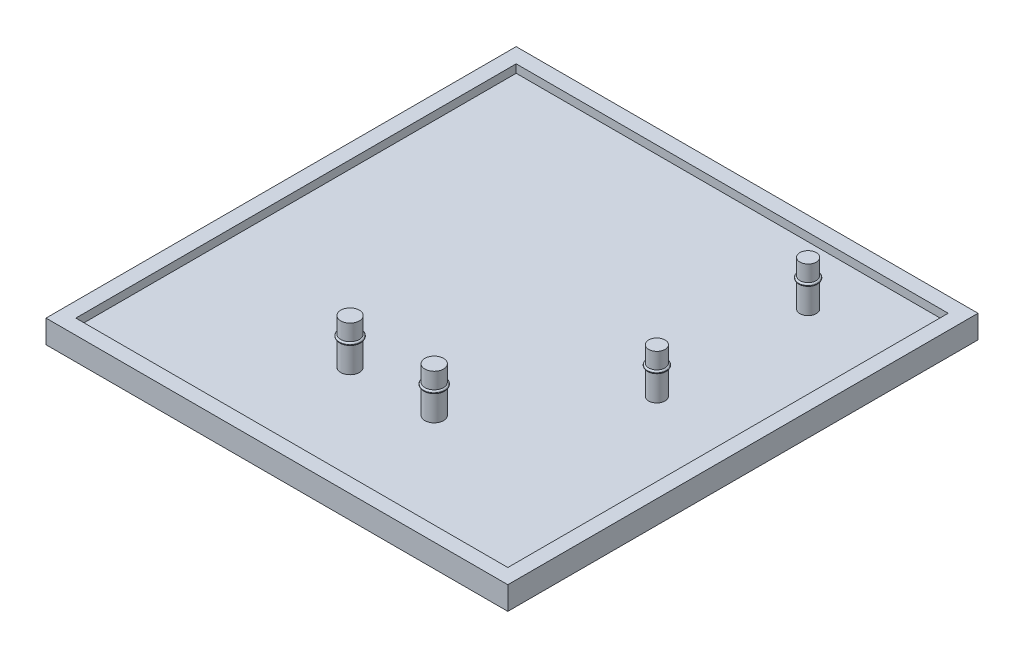
ISO-10303-21;
HEADER;
FILE_DESCRIPTION(('STEP AP214'),'2;1');
FILE_NAME('part.step','',(''),(''),'','','');
FILE_SCHEMA(('AUTOMOTIVE_DESIGN { 1 0 10303 214 1 1 1 1 }'));
ENDSEC;
DATA;
#1=APPLICATION_CONTEXT('core data for automotive mechanical design processes');
#2=APPLICATION_PROTOCOL_DEFINITION('international standard','automotive_design',2000,#1);
#3=PRODUCT_CONTEXT('',#1,'mechanical');
#4=PRODUCT('Part','Part','',(#3));
#5=PRODUCT_RELATED_PRODUCT_CATEGORY('part','',(#4));
#6=PRODUCT_DEFINITION_FORMATION('','',#4);
#7=PRODUCT_DEFINITION_CONTEXT('part definition',#1,'design');
#8=PRODUCT_DEFINITION('design','',#6,#7);
#9=PRODUCT_DEFINITION_SHAPE('','',#8);
#10=(LENGTH_UNIT() NAMED_UNIT(*) SI_UNIT(.MILLI.,.METRE.));
#11=(NAMED_UNIT(*) PLANE_ANGLE_UNIT() SI_UNIT($,.RADIAN.));
#12=(NAMED_UNIT(*) SI_UNIT($,.STERADIAN.) SOLID_ANGLE_UNIT());
#13=UNCERTAINTY_MEASURE_WITH_UNIT(LENGTH_MEASURE(1.E-05),#10,'distance_accuracy_value','');
#14=(GEOMETRIC_REPRESENTATION_CONTEXT(3) GLOBAL_UNCERTAINTY_ASSIGNED_CONTEXT((#13)) GLOBAL_UNIT_ASSIGNED_CONTEXT((#10,
#11,#12)) REPRESENTATION_CONTEXT('',''));
#15=CARTESIAN_POINT('',(0.,0.,0.));
#16=DIRECTION('',(0.,0.,1.));
#17=DIRECTION('',(1.,0.,0.));
#18=AXIS2_PLACEMENT_3D('',#15,#16,#17);
#19=CARTESIAN_POINT('',(62.2046,7.4168,-67.691));
#20=DIRECTION('',(0.,-1.,0.));
#21=DIRECTION('',(0.,0.,-1.));
#22=AXIS2_PLACEMENT_3D('',#19,#20,#21);
#23=PLANE('',#22);
#24=CARTESIAN_POINT('',(62.2046,7.4168,-67.691));
#25=DIRECTION('',(0.,-1.,0.));
#26=DIRECTION('',(0.,0.,-1.));
#27=AXIS2_PLACEMENT_3D('',#24,#25,#26);
#28=CIRCLE('',#27,1.397);
#29=CARTESIAN_POINT('',(62.2046,7.4168,-69.088));
#30=VERTEX_POINT('',#29);
#31=EDGE_CURVE('E11',#30,#30,#28,.F.);
#32=ORIENTED_EDGE('',*,*,#31,.T.);
#33=EDGE_LOOP('',(#32));
#34=FACE_BOUND('',#33,.T.);
#35=ADVANCED_FACE('F49',(#34),#23,.F.);
#36=CARTESIAN_POINT('',(62.2046,6.9088,-67.691));
#37=DIRECTION('',(0.,-1.,0.));
#38=DIRECTION('',(0.,0.,-1.));
#39=AXIS2_PLACEMENT_3D('',#36,#37,#38);
#40=PLANE('',#39);
#41=CARTESIAN_POINT('',(62.2046,6.9088,-67.691));
#42=DIRECTION('',(0.,-1.,0.));
#43=DIRECTION('',(0.,0.,-1.));
#44=AXIS2_PLACEMENT_3D('',#41,#42,#43);
#45=CIRCLE('',#44,1.397);
#46=CARTESIAN_POINT('',(62.2046,6.9088,-69.088));
#47=VERTEX_POINT('',#46);
#48=EDGE_CURVE('E59',#47,#47,#45,.T.);
#49=ORIENTED_EDGE('',*,*,#48,.T.);
#50=EDGE_LOOP('',(#49));
#51=FACE_BOUND('',#50,.T.);
#52=ADVANCED_FACE('F75',(#51),#40,.T.);
#53=CARTESIAN_POINT('',(62.2046,7.1628,-67.691));
#54=DIRECTION('',(0.,-1.,0.));
#55=DIRECTION('',(0.,0.,-1.));
#56=AXIS2_PLACEMENT_3D('',#53,#54,#55);
#57=TOROIDAL_SURFACE('',#56,1.397,0.254);
#58=ORIENTED_EDGE('',*,*,#31,.F.);
#59=EDGE_LOOP('',(#58));
#60=FACE_BOUND('',#59,.T.);
#61=CARTESIAN_POINT('',(62.2046,7.1628,-67.691));
#62=DIRECTION('',(0.,-1.,0.));
#63=DIRECTION('',(0.,0.,-1.));
#64=AXIS2_PLACEMENT_3D('',#61,#62,#63);
#65=CIRCLE('',#64,1.651);
#66=CARTESIAN_POINT('',(62.2046,7.1628,-69.342));
#67=VERTEX_POINT('',#66);
#68=EDGE_CURVE('E53',#67,#67,#65,.T.);
#69=ORIENTED_EDGE('',*,*,#68,.F.);
#70=EDGE_LOOP('',(#69));
#71=FACE_BOUND('',#70,.T.);
#72=ADVANCED_FACE('F55',(#60,#71),#57,.T.);
#73=CARTESIAN_POINT('',(62.2046,7.1628,-67.691));
#74=DIRECTION('',(0.,-1.,0.));
#75=DIRECTION('',(0.,0.,-1.));
#76=AXIS2_PLACEMENT_3D('',#73,#74,#75);
#77=TOROIDAL_SURFACE('',#76,1.397,0.254);
#78=ORIENTED_EDGE('',*,*,#68,.T.);
#79=EDGE_LOOP('',(#78));
#80=FACE_BOUND('',#79,.T.);
#81=ORIENTED_EDGE('',*,*,#48,.F.);
#82=EDGE_LOOP('',(#81));
#83=FACE_BOUND('',#82,.T.);
#84=ADVANCED_FACE('F69',(#80,#83),#77,.T.);
#85=CLOSED_SHELL('',(#35,#52,#72,#84));
#86=MANIFOLD_SOLID_BREP('B2',#85);
#87=CARTESIAN_POINT('',(62.2046,7.4168,-41.91));
#88=DIRECTION('',(0.,-1.,0.));
#89=DIRECTION('',(0.,0.,-1.));
#90=AXIS2_PLACEMENT_3D('',#87,#88,#89);
#91=PLANE('',#90);
#92=CARTESIAN_POINT('',(62.2046,7.4168,-41.91));
#93=DIRECTION('',(0.,-1.,0.));
#94=DIRECTION('',(0.,0.,-1.));
#95=AXIS2_PLACEMENT_3D('',#92,#93,#94);
#96=CIRCLE('',#95,1.397);
#97=CARTESIAN_POINT('',(62.2046,7.4168,-43.307));
#98=VERTEX_POINT('',#97);
#99=EDGE_CURVE('E47',#98,#98,#96,.F.);
#100=ORIENTED_EDGE('',*,*,#99,.T.);
#101=EDGE_LOOP('',(#100));
#102=FACE_BOUND('',#101,.T.);
#103=ADVANCED_FACE('F112',(#102),#91,.F.);
#104=CARTESIAN_POINT('',(62.2046,6.9088,-41.91));
#105=DIRECTION('',(0.,-1.,0.));
#106=DIRECTION('',(0.,0.,-1.));
#107=AXIS2_PLACEMENT_3D('',#104,#105,#106);
#108=PLANE('',#107);
#109=CARTESIAN_POINT('',(62.2046,6.9088,-41.91));
#110=DIRECTION('',(0.,-1.,0.));
#111=DIRECTION('',(0.,0.,-1.));
#112=AXIS2_PLACEMENT_3D('',#109,#110,#111);
#113=CIRCLE('',#112,1.397);
#114=CARTESIAN_POINT('',(62.2046,6.9088,-43.307));
#115=VERTEX_POINT('',#114);
#116=EDGE_CURVE('E125',#115,#115,#113,.T.);
#117=ORIENTED_EDGE('',*,*,#116,.T.);
#118=EDGE_LOOP('',(#117));
#119=FACE_BOUND('',#118,.T.);
#120=ADVANCED_FACE('F137',(#119),#108,.T.);
#121=CARTESIAN_POINT('',(62.2046,7.1628,-41.91));
#122=DIRECTION('',(0.,-1.,0.));
#123=DIRECTION('',(0.,0.,-1.));
#124=AXIS2_PLACEMENT_3D('',#121,#122,#123);
#125=TOROIDAL_SURFACE('',#124,1.397,0.254);
#126=ORIENTED_EDGE('',*,*,#99,.F.);
#127=EDGE_LOOP('',(#126));
#128=FACE_BOUND('',#127,.T.);
#129=CARTESIAN_POINT('',(62.2046,7.1628,-41.91));
#130=DIRECTION('',(0.,-1.,0.));
#131=DIRECTION('',(0.,0.,-1.));
#132=AXIS2_PLACEMENT_3D('',#129,#130,#131);
#133=CIRCLE('',#132,1.651);
#134=CARTESIAN_POINT('',(62.2046,7.1628,-43.561));
#135=VERTEX_POINT('',#134);
#136=EDGE_CURVE('E117',#135,#135,#133,.T.);
#137=ORIENTED_EDGE('',*,*,#136,.F.);
#138=EDGE_LOOP('',(#137));
#139=FACE_BOUND('',#138,.T.);
#140=ADVANCED_FACE('F116',(#128,#139),#125,.T.);
#141=CARTESIAN_POINT('',(62.2046,7.1628,-41.91));
#142=DIRECTION('',(0.,-1.,0.));
#143=DIRECTION('',(0.,0.,-1.));
#144=AXIS2_PLACEMENT_3D('',#141,#142,#143);
#145=TOROIDAL_SURFACE('',#144,1.397,0.254);
#146=ORIENTED_EDGE('',*,*,#136,.T.);
#147=EDGE_LOOP('',(#146));
#148=FACE_BOUND('',#147,.T.);
#149=ORIENTED_EDGE('',*,*,#116,.F.);
#150=EDGE_LOOP('',(#149));
#151=FACE_BOUND('',#150,.T.);
#152=ADVANCED_FACE('F135',(#148,#151),#145,.T.);
#153=CLOSED_SHELL('',(#103,#120,#140,#152));
#154=MANIFOLD_SOLID_BREP('B6',#153);
#155=CARTESIAN_POINT('',(46.0375,7.4168,-20.1295));
#156=DIRECTION('',(0.,-1.,0.));
#157=DIRECTION('',(0.,0.,-1.));
#158=AXIS2_PLACEMENT_3D('',#155,#156,#157);
#159=PLANE('',#158);
#160=CARTESIAN_POINT('',(46.0375,7.4168,-20.1295));
#161=DIRECTION('',(0.,-1.,0.));
#162=DIRECTION('',(0.,0.,-1.));
#163=AXIS2_PLACEMENT_3D('',#160,#161,#162);
#164=CIRCLE('',#163,1.5875);
#165=CARTESIAN_POINT('',(46.0375,7.4168,-21.717));
#166=VERTEX_POINT('',#165);
#167=EDGE_CURVE('E113',#166,#166,#164,.F.);
#168=ORIENTED_EDGE('',*,*,#167,.T.);
#169=EDGE_LOOP('',(#168));
#170=FACE_BOUND('',#169,.T.);
#171=ADVANCED_FACE('F178',(#170),#159,.F.);
#172=CARTESIAN_POINT('',(46.0375,6.9088,-20.1295));
#173=DIRECTION('',(0.,-1.,0.));
#174=DIRECTION('',(0.,0.,-1.));
#175=AXIS2_PLACEMENT_3D('',#172,#173,#174);
#176=PLANE('',#175);
#177=CARTESIAN_POINT('',(46.0375,6.9088,-20.1295));
#178=DIRECTION('',(0.,-1.,0.));
#179=DIRECTION('',(0.,0.,-1.));
#180=AXIS2_PLACEMENT_3D('',#177,#178,#179);
#181=CIRCLE('',#180,1.5875);
#182=CARTESIAN_POINT('',(46.0375,6.9088,-21.717));
#183=VERTEX_POINT('',#182);
#184=EDGE_CURVE('E187',#183,#183,#181,.T.);
#185=ORIENTED_EDGE('',*,*,#184,.T.);
#186=EDGE_LOOP('',(#185));
#187=FACE_BOUND('',#186,.T.);
#188=ADVANCED_FACE('F198',(#187),#176,.T.);
#189=CARTESIAN_POINT('',(46.0375,7.1628,-20.1295));
#190=DIRECTION('',(0.,-1.,0.));
#191=DIRECTION('',(0.,0.,-1.));
#192=AXIS2_PLACEMENT_3D('',#189,#190,#191);
#193=TOROIDAL_SURFACE('',#192,1.5875,0.254);
#194=ORIENTED_EDGE('',*,*,#167,.F.);
#195=EDGE_LOOP('',(#194));
#196=FACE_BOUND('',#195,.T.);
#197=CARTESIAN_POINT('',(46.0375,7.1628,-20.1295));
#198=DIRECTION('',(0.,-1.,0.));
#199=DIRECTION('',(0.,0.,-1.));
#200=AXIS2_PLACEMENT_3D('',#197,#198,#199);
#201=CIRCLE('',#200,1.8415);
#202=CARTESIAN_POINT('',(46.0375,7.1628,-21.971));
#203=VERTEX_POINT('',#202);
#204=EDGE_CURVE('E185',#203,#203,#201,.T.);
#205=ORIENTED_EDGE('',*,*,#204,.F.);
#206=EDGE_LOOP('',(#205));
#207=FACE_BOUND('',#206,.T.);
#208=ADVANCED_FACE('F179',(#196,#207),#193,.T.);
#209=CARTESIAN_POINT('',(46.0375,7.1628,-20.1295));
#210=DIRECTION('',(0.,-1.,0.));
#211=DIRECTION('',(0.,0.,-1.));
#212=AXIS2_PLACEMENT_3D('',#209,#210,#211);
#213=TOROIDAL_SURFACE('',#212,1.5875,0.254);
#214=ORIENTED_EDGE('',*,*,#204,.T.);
#215=EDGE_LOOP('',(#214));
#216=FACE_BOUND('',#215,.T.);
#217=ORIENTED_EDGE('',*,*,#184,.F.);
#218=EDGE_LOOP('',(#217));
#219=FACE_BOUND('',#218,.T.);
#220=ADVANCED_FACE('F197',(#216,#219),#213,.T.);
#221=CLOSED_SHELL('',(#171,#188,#208,#220));
#222=MANIFOLD_SOLID_BREP('B42',#221);
#223=CARTESIAN_POINT('',(31.7627,7.4168,-20.066));
#224=DIRECTION('',(0.,-1.,0.));
#225=DIRECTION('',(0.,0.,-1.));
#226=AXIS2_PLACEMENT_3D('',#223,#224,#225);
#227=PLANE('',#226);
#228=CARTESIAN_POINT('',(31.7627,7.4168,-20.066));
#229=DIRECTION('',(0.,-1.,0.));
#230=DIRECTION('',(0.,0.,-1.));
#231=AXIS2_PLACEMENT_3D('',#228,#229,#230);
#232=CIRCLE('',#231,1.5875);
#233=CARTESIAN_POINT('',(31.7627,7.4168,-21.6535));
#234=VERTEX_POINT('',#233);
#235=EDGE_CURVE('E180',#234,#234,#232,.F.);
#236=ORIENTED_EDGE('',*,*,#235,.T.);
#237=EDGE_LOOP('',(#236));
#238=FACE_BOUND('',#237,.T.);
#239=ADVANCED_FACE('F243',(#238),#227,.F.);
#240=CARTESIAN_POINT('',(31.7627,6.9088,-20.066));
#241=DIRECTION('',(0.,-1.,0.));
#242=DIRECTION('',(0.,0.,-1.));
#243=AXIS2_PLACEMENT_3D('',#240,#241,#242);
#244=PLANE('',#243);
#245=CARTESIAN_POINT('',(31.7627,6.9088,-20.066));
#246=DIRECTION('',(0.,-1.,0.));
#247=DIRECTION('',(0.,0.,-1.));
#248=AXIS2_PLACEMENT_3D('',#245,#246,#247);
#249=CIRCLE('',#248,1.5875);
#250=CARTESIAN_POINT('',(31.7627,6.9088,-21.6535));
#251=VERTEX_POINT('',#250);
#252=EDGE_CURVE('E252',#251,#251,#249,.T.);
#253=ORIENTED_EDGE('',*,*,#252,.T.);
#254=EDGE_LOOP('',(#253));
#255=FACE_BOUND('',#254,.T.);
#256=ADVANCED_FACE('F263',(#255),#244,.T.);
#257=CARTESIAN_POINT('',(31.7627,7.1628,-20.066));
#258=DIRECTION('',(0.,-1.,0.));
#259=DIRECTION('',(0.,0.,-1.));
#260=AXIS2_PLACEMENT_3D('',#257,#258,#259);
#261=TOROIDAL_SURFACE('',#260,1.5875,0.254);
#262=ORIENTED_EDGE('',*,*,#235,.F.);
#263=EDGE_LOOP('',(#262));
#264=FACE_BOUND('',#263,.T.);
#265=CARTESIAN_POINT('',(31.7627,7.1628,-20.066));
#266=DIRECTION('',(0.,-1.,0.));
#267=DIRECTION('',(0.,0.,-1.));
#268=AXIS2_PLACEMENT_3D('',#265,#266,#267);
#269=CIRCLE('',#268,1.8415);
#270=CARTESIAN_POINT('',(31.7627,7.1628,-21.9075));
#271=VERTEX_POINT('',#270);
#272=EDGE_CURVE('E250',#271,#271,#269,.T.);
#273=ORIENTED_EDGE('',*,*,#272,.F.);
#274=EDGE_LOOP('',(#273));
#275=FACE_BOUND('',#274,.T.);
#276=ADVANCED_FACE('F244',(#264,#275),#261,.T.);
#277=CARTESIAN_POINT('',(31.7627,7.1628,-20.066));
#278=DIRECTION('',(0.,-1.,0.));
#279=DIRECTION('',(0.,0.,-1.));
#280=AXIS2_PLACEMENT_3D('',#277,#278,#279);
#281=TOROIDAL_SURFACE('',#280,1.5875,0.254);
#282=ORIENTED_EDGE('',*,*,#272,.T.);
#283=EDGE_LOOP('',(#282));
#284=FACE_BOUND('',#283,.T.);
#285=ORIENTED_EDGE('',*,*,#252,.F.);
#286=EDGE_LOOP('',(#285));
#287=FACE_BOUND('',#286,.T.);
#288=ADVANCED_FACE('F262',(#284,#287),#281,.T.);
#289=CLOSED_SHELL('',(#239,#256,#276,#288));
#290=MANIFOLD_SOLID_BREP('B108',#289);
#291=CARTESIAN_POINT('',(0.,3.937,0.));
#292=DIRECTION('',(-1.,0.,0.));
#293=DIRECTION('',(0.,0.,1.));
#294=AXIS2_PLACEMENT_3D('',#291,#292,#293);
#295=PLANE('',#294);
#296=DIRECTION('',(0.,0.,-1.));
#297=VECTOR('',#296,1.);
#298=CARTESIAN_POINT('',(0.,0.,0.));
#299=LINE('',#298,#297);
#300=CARTESIAN_POINT('',(0.,0.,0.));
#301=VERTEX_POINT('',#300);
#302=CARTESIAN_POINT('',(0.,0.,-80.137));
#303=VERTEX_POINT('',#302);
#304=EDGE_CURVE('E382',#301,#303,#299,.T.);
#305=ORIENTED_EDGE('',*,*,#304,.F.);
#306=DIRECTION('',(0.,-1.,0.));
#307=VECTOR('',#306,1.);
#308=CARTESIAN_POINT('',(0.,3.937,0.));
#309=LINE('',#308,#307);
#310=CARTESIAN_POINT('',(0.,3.937,0.));
#311=VERTEX_POINT('',#310);
#312=EDGE_CURVE('E325',#311,#301,#309,.T.);
#313=ORIENTED_EDGE('',*,*,#312,.F.);
#314=DIRECTION('',(0.,0.,-1.));
#315=VECTOR('',#314,1.);
#316=CARTESIAN_POINT('',(0.,3.937,0.));
#317=LINE('',#316,#315);
#318=CARTESIAN_POINT('',(0.,3.937,-80.137));
#319=VERTEX_POINT('',#318);
#320=EDGE_CURVE('E419',#311,#319,#317,.T.);
#321=ORIENTED_EDGE('',*,*,#320,.T.);
#322=DIRECTION('',(0.,-1.,0.));
#323=VECTOR('',#322,1.);
#324=CARTESIAN_POINT('',(0.,3.937,-80.137));
#325=LINE('',#324,#323);
#326=EDGE_CURVE('E350',#319,#303,#325,.T.);
#327=ORIENTED_EDGE('',*,*,#326,.T.);
#328=EDGE_LOOP('',(#305,#313,#321,#327));
#329=FACE_BOUND('',#328,.T.);
#330=ADVANCED_FACE('F299',(#329),#295,.T.);
#331=CARTESIAN_POINT('',(0.,3.937,0.));
#332=DIRECTION('',(0.,0.,-1.));
#333=DIRECTION('',(-1.,0.,0.));
#334=AXIS2_PLACEMENT_3D('',#331,#332,#333);
#335=PLANE('',#334);
#336=DIRECTION('',(1.,0.,0.));
#337=VECTOR('',#336,1.);
#338=CARTESIAN_POINT('',(0.,0.,0.));
#339=LINE('',#338,#337);
#340=CARTESIAN_POINT('',(78.7146,0.,0.));
#341=VERTEX_POINT('',#340);
#342=EDGE_CURVE('E422',#301,#341,#339,.T.);
#343=ORIENTED_EDGE('',*,*,#342,.T.);
#344=DIRECTION('',(0.,-1.,0.));
#345=VECTOR('',#344,1.);
#346=CARTESIAN_POINT('',(78.7146,3.937,0.));
#347=LINE('',#346,#345);
#348=CARTESIAN_POINT('',(78.7146,3.937,0.));
#349=VERTEX_POINT('',#348);
#350=EDGE_CURVE('E437',#349,#341,#347,.T.);
#351=ORIENTED_EDGE('',*,*,#350,.F.);
#352=DIRECTION('',(1.,0.,0.));
#353=VECTOR('',#352,1.);
#354=CARTESIAN_POINT('',(0.,3.937,0.));
#355=LINE('',#354,#353);
#356=EDGE_CURVE('E428',#311,#349,#355,.T.);
#357=ORIENTED_EDGE('',*,*,#356,.F.);
#358=ORIENTED_EDGE('',*,*,#312,.T.);
#359=EDGE_LOOP('',(#343,#351,#357,#358));
#360=FACE_BOUND('',#359,.T.);
#361=ADVANCED_FACE('F480',(#360),#335,.F.);
#362=CARTESIAN_POINT('',(78.7146,3.937,0.));
#363=DIRECTION('',(-1.,0.,0.));
#364=DIRECTION('',(0.,0.,1.));
#365=AXIS2_PLACEMENT_3D('',#362,#363,#364);
#366=PLANE('',#365);
#367=DIRECTION('',(0.,0.,-1.));
#368=VECTOR('',#367,1.);
#369=CARTESIAN_POINT('',(78.7146,0.,0.));
#370=LINE('',#369,#368);
#371=CARTESIAN_POINT('',(78.7146,0.,-80.137));
#372=VERTEX_POINT('',#371);
#373=EDGE_CURVE('E433',#341,#372,#370,.T.);
#374=ORIENTED_EDGE('',*,*,#373,.T.);
#375=DIRECTION('',(0.,-1.,0.));
#376=VECTOR('',#375,1.);
#377=CARTESIAN_POINT('',(78.7146,3.937,-80.137));
#378=LINE('',#377,#376);
#379=CARTESIAN_POINT('',(78.7146,3.937,-80.137));
#380=VERTEX_POINT('',#379);
#381=EDGE_CURVE('E445',#380,#372,#378,.T.);
#382=ORIENTED_EDGE('',*,*,#381,.F.);
#383=DIRECTION('',(0.,0.,-1.));
#384=VECTOR('',#383,1.);
#385=CARTESIAN_POINT('',(78.7146,3.937,0.));
#386=LINE('',#385,#384);
#387=EDGE_CURVE('E425',#349,#380,#386,.T.);
#388=ORIENTED_EDGE('',*,*,#387,.F.);
#389=ORIENTED_EDGE('',*,*,#350,.T.);
#390=EDGE_LOOP('',(#374,#382,#388,#389));
#391=FACE_BOUND('',#390,.T.);
#392=ADVANCED_FACE('F482',(#391),#366,.F.);
#393=CARTESIAN_POINT('',(0.,3.937,-80.137));
#394=DIRECTION('',(0.,0.,-1.));
#395=DIRECTION('',(-1.,0.,0.));
#396=AXIS2_PLACEMENT_3D('',#393,#394,#395);
#397=PLANE('',#396);
#398=DIRECTION('',(1.,0.,0.));
#399=VECTOR('',#398,1.);
#400=CARTESIAN_POINT('',(0.,0.,-80.137));
#401=LINE('',#400,#399);
#402=EDGE_CURVE('E427',#303,#372,#401,.T.);
#403=ORIENTED_EDGE('',*,*,#402,.F.);
#404=ORIENTED_EDGE('',*,*,#326,.F.);
#405=DIRECTION('',(1.,0.,0.));
#406=VECTOR('',#405,1.);
#407=CARTESIAN_POINT('',(0.,3.937,-80.137));
#408=LINE('',#407,#406);
#409=EDGE_CURVE('E423',#319,#380,#408,.T.);
#410=ORIENTED_EDGE('',*,*,#409,.T.);
#411=ORIENTED_EDGE('',*,*,#381,.T.);
#412=EDGE_LOOP('',(#403,#404,#410,#411));
#413=FACE_BOUND('',#412,.T.);
#414=ADVANCED_FACE('F491',(#413),#397,.T.);
#415=CARTESIAN_POINT('',(0.,3.937,0.));
#416=DIRECTION('',(0.,-1.,0.));
#417=DIRECTION('',(0.,0.,-1.));
#418=AXIS2_PLACEMENT_3D('',#415,#416,#417);
#419=PLANE('',#418);
#420=DIRECTION('',(1.,0.,0.));
#421=VECTOR('',#420,1.);
#422=CARTESIAN_POINT('',(0.,3.937,-2.54));
#423=LINE('',#422,#421);
#424=CARTESIAN_POINT('',(2.54,3.937,-2.54));
#425=VERTEX_POINT('',#424);
#426=CARTESIAN_POINT('',(76.1746,3.937,-2.54));
#427=VERTEX_POINT('',#426);
#428=EDGE_CURVE('E410',#425,#427,#423,.T.);
#429=ORIENTED_EDGE('',*,*,#428,.F.);
#430=DIRECTION('',(0.,0.,-1.));
#431=VECTOR('',#430,1.);
#432=CARTESIAN_POINT('',(2.54,3.937,0.));
#433=LINE('',#432,#431);
#434=CARTESIAN_POINT('',(2.54,3.937,-77.597));
#435=VERTEX_POINT('',#434);
#436=EDGE_CURVE('E377',#425,#435,#433,.T.);
#437=ORIENTED_EDGE('',*,*,#436,.T.);
#438=DIRECTION('',(1.,0.,0.));
#439=VECTOR('',#438,1.);
#440=CARTESIAN_POINT('',(0.,3.937,-77.597));
#441=LINE('',#440,#439);
#442=CARTESIAN_POINT('',(76.1746,3.937,-77.597));
#443=VERTEX_POINT('',#442);
#444=EDGE_CURVE('E414',#435,#443,#441,.T.);
#445=ORIENTED_EDGE('',*,*,#444,.T.);
#446=DIRECTION('',(0.,0.,-1.));
#447=VECTOR('',#446,1.);
#448=CARTESIAN_POINT('',(76.1746,3.937,0.));
#449=LINE('',#448,#447);
#450=EDGE_CURVE('E413',#427,#443,#449,.T.);
#451=ORIENTED_EDGE('',*,*,#450,.F.);
#452=EDGE_LOOP('',(#429,#437,#445,#451));
#453=FACE_BOUND('',#452,.T.);
#454=ORIENTED_EDGE('',*,*,#320,.F.);
#455=ORIENTED_EDGE('',*,*,#356,.T.);
#456=ORIENTED_EDGE('',*,*,#387,.T.);
#457=ORIENTED_EDGE('',*,*,#409,.F.);
#458=EDGE_LOOP('',(#454,#455,#456,#457));
#459=FACE_BOUND('',#458,.T.);
#460=ADVANCED_FACE('F495',(#453,#459),#419,.F.);
#461=CARTESIAN_POINT('',(0.,0.,0.));
#462=DIRECTION('',(0.,-1.,0.));
#463=DIRECTION('',(0.,0.,-1.));
#464=AXIS2_PLACEMENT_3D('',#461,#462,#463);
#465=PLANE('',#464);
#466=ORIENTED_EDGE('',*,*,#304,.T.);
#467=ORIENTED_EDGE('',*,*,#402,.T.);
#468=ORIENTED_EDGE('',*,*,#373,.F.);
#469=ORIENTED_EDGE('',*,*,#342,.F.);
#470=EDGE_LOOP('',(#466,#467,#468,#469));
#471=FACE_BOUND('',#470,.T.);
#472=ADVANCED_FACE('F484',(#471),#465,.T.);
#473=CARTESIAN_POINT('',(2.54,3.937,0.));
#474=DIRECTION('',(-1.,0.,0.));
#475=DIRECTION('',(0.,0.,1.));
#476=AXIS2_PLACEMENT_3D('',#473,#474,#475);
#477=PLANE('',#476);
#478=DIRECTION('',(0.,0.,-1.));
#479=VECTOR('',#478,1.);
#480=CARTESIAN_POINT('',(2.54,2.54,0.));
#481=LINE('',#480,#479);
#482=CARTESIAN_POINT('',(2.54,2.54,-2.54));
#483=VERTEX_POINT('',#482);
#484=CARTESIAN_POINT('',(2.54,2.54,-77.597));
#485=VERTEX_POINT('',#484);
#486=EDGE_CURVE('E376',#483,#485,#481,.T.);
#487=ORIENTED_EDGE('',*,*,#486,.T.);
#488=DIRECTION('',(0.,-1.,0.));
#489=VECTOR('',#488,1.);
#490=CARTESIAN_POINT('',(2.54,3.937,-77.597));
#491=LINE('',#490,#489);
#492=EDGE_CURVE('E408',#435,#485,#491,.T.);
#493=ORIENTED_EDGE('',*,*,#492,.F.);
#494=ORIENTED_EDGE('',*,*,#436,.F.);
#495=DIRECTION('',(0.,-1.,0.));
#496=VECTOR('',#495,1.);
#497=CARTESIAN_POINT('',(2.54,3.937,-2.54));
#498=LINE('',#497,#496);
#499=EDGE_CURVE('E375',#425,#483,#498,.T.);
#500=ORIENTED_EDGE('',*,*,#499,.T.);
#501=EDGE_LOOP('',(#487,#493,#494,#500));
#502=FACE_BOUND('',#501,.T.);
#503=ADVANCED_FACE('F372',(#502),#477,.F.);
#504=CARTESIAN_POINT('',(0.,3.937,-2.54));
#505=DIRECTION('',(0.,0.,-1.));
#506=DIRECTION('',(-1.,0.,0.));
#507=AXIS2_PLACEMENT_3D('',#504,#505,#506);
#508=PLANE('',#507);
#509=DIRECTION('',(1.,0.,0.));
#510=VECTOR('',#509,1.);
#511=CARTESIAN_POINT('',(0.,2.54,-2.54));
#512=LINE('',#511,#510);
#513=CARTESIAN_POINT('',(76.1746,2.54,-2.54));
#514=VERTEX_POINT('',#513);
#515=EDGE_CURVE('E383',#483,#514,#512,.T.);
#516=ORIENTED_EDGE('',*,*,#515,.F.);
#517=ORIENTED_EDGE('',*,*,#499,.F.);
#518=ORIENTED_EDGE('',*,*,#428,.T.);
#519=DIRECTION('',(0.,-1.,0.));
#520=VECTOR('',#519,1.);
#521=CARTESIAN_POINT('',(76.1746,3.937,-2.54));
#522=LINE('',#521,#520);
#523=EDGE_CURVE('E385',#427,#514,#522,.T.);
#524=ORIENTED_EDGE('',*,*,#523,.T.);
#525=EDGE_LOOP('',(#516,#517,#518,#524));
#526=FACE_BOUND('',#525,.T.);
#527=ADVANCED_FACE('F388',(#526),#508,.T.);
#528=CARTESIAN_POINT('',(76.1746,3.937,0.));
#529=DIRECTION('',(-1.,0.,0.));
#530=DIRECTION('',(0.,0.,1.));
#531=AXIS2_PLACEMENT_3D('',#528,#529,#530);
#532=PLANE('',#531);
#533=DIRECTION('',(0.,0.,-1.));
#534=VECTOR('',#533,1.);
#535=CARTESIAN_POINT('',(76.1746,2.54,0.));
#536=LINE('',#535,#534);
#537=CARTESIAN_POINT('',(76.1746,2.54,-77.597));
#538=VERTEX_POINT('',#537);
#539=EDGE_CURVE('E392',#514,#538,#536,.T.);
#540=ORIENTED_EDGE('',*,*,#539,.F.);
#541=ORIENTED_EDGE('',*,*,#523,.F.);
#542=ORIENTED_EDGE('',*,*,#450,.T.);
#543=DIRECTION('',(0.,-1.,0.));
#544=VECTOR('',#543,1.);
#545=CARTESIAN_POINT('',(76.1746,3.937,-77.597));
#546=LINE('',#545,#544);
#547=EDGE_CURVE('E312',#443,#538,#546,.T.);
#548=ORIENTED_EDGE('',*,*,#547,.T.);
#549=EDGE_LOOP('',(#540,#541,#542,#548));
#550=FACE_BOUND('',#549,.T.);
#551=ADVANCED_FACE('F510',(#550),#532,.T.);
#552=CARTESIAN_POINT('',(0.,3.937,-77.597));
#553=DIRECTION('',(0.,0.,-1.));
#554=DIRECTION('',(-1.,0.,0.));
#555=AXIS2_PLACEMENT_3D('',#552,#553,#554);
#556=PLANE('',#555);
#557=DIRECTION('',(1.,0.,0.));
#558=VECTOR('',#557,1.);
#559=CARTESIAN_POINT('',(0.,2.54,-77.597));
#560=LINE('',#559,#558);
#561=EDGE_CURVE('E393',#485,#538,#560,.T.);
#562=ORIENTED_EDGE('',*,*,#561,.T.);
#563=ORIENTED_EDGE('',*,*,#547,.F.);
#564=ORIENTED_EDGE('',*,*,#444,.F.);
#565=ORIENTED_EDGE('',*,*,#492,.T.);
#566=EDGE_LOOP('',(#562,#563,#564,#565));
#567=FACE_BOUND('',#566,.T.);
#568=ADVANCED_FACE('F460',(#567),#556,.F.);
#569=CARTESIAN_POINT('',(0.,2.54,0.));
#570=DIRECTION('',(0.,-1.,0.));
#571=DIRECTION('',(0.,0.,-1.));
#572=AXIS2_PLACEMENT_3D('',#569,#570,#571);
#573=PLANE('',#572);
#574=CARTESIAN_POINT('',(62.2046,2.54,-67.691));
#575=DIRECTION('',(0.,-1.,0.));
#576=DIRECTION('',(0.,0.,-1.));
#577=AXIS2_PLACEMENT_3D('',#574,#575,#576);
#578=CIRCLE('',#577,1.397);
#579=CARTESIAN_POINT('',(62.2046,2.54,-69.088));
#580=VERTEX_POINT('',#579);
#581=EDGE_CURVE('E241',#580,#580,#578,.F.);
#582=ORIENTED_EDGE('',*,*,#581,.F.);
#583=EDGE_LOOP('',(#582));
#584=FACE_BOUND('',#583,.T.);
#585=CARTESIAN_POINT('',(62.2046,2.54,-41.91));
#586=DIRECTION('',(0.,-1.,0.));
#587=DIRECTION('',(0.,0.,-1.));
#588=AXIS2_PLACEMENT_3D('',#585,#586,#587);
#589=CIRCLE('',#588,1.397);
#590=CARTESIAN_POINT('',(62.2046,2.54,-43.307));
#591=VERTEX_POINT('',#590);
#592=EDGE_CURVE('E306',#591,#591,#589,.F.);
#593=ORIENTED_EDGE('',*,*,#592,.F.);
#594=EDGE_LOOP('',(#593));
#595=FACE_BOUND('',#594,.T.);
#596=CARTESIAN_POINT('',(46.0375,2.54,-20.1295));
#597=DIRECTION('',(0.,-1.,0.));
#598=DIRECTION('',(0.,0.,-1.));
#599=AXIS2_PLACEMENT_3D('',#596,#597,#598);
#600=CIRCLE('',#599,1.5875);
#601=CARTESIAN_POINT('',(46.0375,2.54,-21.717));
#602=VERTEX_POINT('',#601);
#603=EDGE_CURVE('E450',#602,#602,#600,.F.);
#604=ORIENTED_EDGE('',*,*,#603,.F.);
#605=EDGE_LOOP('',(#604));
#606=FACE_BOUND('',#605,.T.);
#607=CARTESIAN_POINT('',(31.7627,2.54,-20.066));
#608=DIRECTION('',(0.,-1.,0.));
#609=DIRECTION('',(0.,0.,-1.));
#610=AXIS2_PLACEMENT_3D('',#607,#608,#609);
#611=CIRCLE('',#610,1.5875);
#612=CARTESIAN_POINT('',(31.7627,2.54,-21.6535));
#613=VERTEX_POINT('',#612);
#614=EDGE_CURVE('E438',#613,#613,#611,.F.);
#615=ORIENTED_EDGE('',*,*,#614,.F.);
#616=EDGE_LOOP('',(#615));
#617=FACE_BOUND('',#616,.T.);
#618=ORIENTED_EDGE('',*,*,#486,.F.);
#619=ORIENTED_EDGE('',*,*,#515,.T.);
#620=ORIENTED_EDGE('',*,*,#539,.T.);
#621=ORIENTED_EDGE('',*,*,#561,.F.);
#622=EDGE_LOOP('',(#618,#619,#620,#621));
#623=FACE_BOUND('',#622,.T.);
#624=ADVANCED_FACE('F391',(#584,#595,#606,#617,#623),#573,.F.);
#625=CARTESIAN_POINT('',(31.7627,10.16,-20.066));
#626=DIRECTION('',(0.,-1.,0.));
#627=DIRECTION('',(0.,0.,-1.));
#628=AXIS2_PLACEMENT_3D('',#625,#626,#627);
#629=CYLINDRICAL_SURFACE('',#628,1.5875);
#630=CARTESIAN_POINT('',(31.7627,10.16,-20.066));
#631=DIRECTION('',(0.,1.,0.));
#632=DIRECTION('',(0.,0.,1.));
#633=AXIS2_PLACEMENT_3D('',#630,#631,#632);
#634=CIRCLE('',#633,1.5875);
#635=CARTESIAN_POINT('',(31.7627,10.16,-21.6535));
#636=VERTEX_POINT('',#635);
#637=EDGE_CURVE('E401',#636,#636,#634,.T.);
#638=CARTESIAN_POINT('',(31.7627,10.16,-21.6535));
#639=CARTESIAN_POINT('',(31.7627,10.080625,-21.6535));
#640=CARTESIAN_POINT('',(31.7627,10.00125,-21.6535));
#641=CARTESIAN_POINT('',(31.7627,9.8425,-21.6535));
#642=CARTESIAN_POINT('',(31.7627,9.763125,-21.6535));
#643=CARTESIAN_POINT('',(31.7627,9.604375,-21.6535));
#644=CARTESIAN_POINT('',(31.7627,9.525,-21.6535));
#645=CARTESIAN_POINT('',(31.7627,9.36625,-21.6535));
#646=CARTESIAN_POINT('',(31.7627,9.286875,-21.6535));
#647=CARTESIAN_POINT('',(31.7627,9.128125,-21.6535));
#648=CARTESIAN_POINT('',(31.7627,9.04875,-21.6535));
#649=CARTESIAN_POINT('',(31.7627,8.89,-21.6535));
#650=CARTESIAN_POINT('',(31.7627,8.810625,-21.6535));
#651=CARTESIAN_POINT('',(31.7627,8.651875,-21.6535));
#652=CARTESIAN_POINT('',(31.7627,8.5725,-21.6535));
#653=CARTESIAN_POINT('',(31.7627,8.41375,-21.6535));
#654=CARTESIAN_POINT('',(31.7627,8.334375,-21.6535));
#655=CARTESIAN_POINT('',(31.7627,8.175625,-21.6535));
#656=CARTESIAN_POINT('',(31.7627,8.09625,-21.6535));
#657=CARTESIAN_POINT('',(31.7627,7.9375,-21.6535));
#658=CARTESIAN_POINT('',(31.7627,7.858125,-21.6535));
#659=CARTESIAN_POINT('',(31.7627,7.699375,-21.6535));
#660=CARTESIAN_POINT('',(31.7627,7.62,-21.6535));
#661=CARTESIAN_POINT('',(31.7627,7.46125,-21.6535));
#662=CARTESIAN_POINT('',(31.7627,7.381875,-21.6535));
#663=CARTESIAN_POINT('',(31.7627,7.223125,-21.6535));
#664=CARTESIAN_POINT('',(31.7627,7.14375,-21.6535));
#665=CARTESIAN_POINT('',(31.7627,6.985,-21.6535));
#666=CARTESIAN_POINT('',(31.7627,6.905625,-21.6535));
#667=CARTESIAN_POINT('',(31.7627,6.746875,-21.6535));
#668=CARTESIAN_POINT('',(31.7627,6.6675,-21.6535));
#669=CARTESIAN_POINT('',(31.7627,6.50875,-21.6535));
#670=CARTESIAN_POINT('',(31.7627,6.429375,-21.6535));
#671=CARTESIAN_POINT('',(31.7627,6.270625,-21.6535));
#672=CARTESIAN_POINT('',(31.7627,6.19125,-21.6535));
#673=CARTESIAN_POINT('',(31.7627,6.0325,-21.6535));
#674=CARTESIAN_POINT('',(31.7627,5.953125,-21.6535));
#675=CARTESIAN_POINT('',(31.7627,5.794375,-21.6535));
#676=CARTESIAN_POINT('',(31.7627,5.715,-21.6535));
#677=CARTESIAN_POINT('',(31.7627,5.55625,-21.6535));
#678=CARTESIAN_POINT('',(31.7627,5.476875,-21.6535));
#679=CARTESIAN_POINT('',(31.7627,5.318125,-21.6535));
#680=CARTESIAN_POINT('',(31.7627,5.23875,-21.6535));
#681=CARTESIAN_POINT('',(31.7627,5.08,-21.6535));
#682=CARTESIAN_POINT('',(31.7627,5.000625,-21.6535));
#683=CARTESIAN_POINT('',(31.7627,4.841875,-21.6535));
#684=CARTESIAN_POINT('',(31.7627,4.7625,-21.6535));
#685=CARTESIAN_POINT('',(31.7627,4.60375,-21.6535));
#686=CARTESIAN_POINT('',(31.7627,4.524375,-21.6535));
#687=CARTESIAN_POINT('',(31.7627,4.365625,-21.6535));
#688=CARTESIAN_POINT('',(31.7627,4.28625,-21.6535));
#689=CARTESIAN_POINT('',(31.7627,4.1275,-21.6535));
#690=CARTESIAN_POINT('',(31.7627,4.048125,-21.6535));
#691=CARTESIAN_POINT('',(31.7627,3.889375,-21.6535));
#692=CARTESIAN_POINT('',(31.7627,3.81,-21.6535));
#693=CARTESIAN_POINT('',(31.7627,3.65125,-21.6535));
#694=CARTESIAN_POINT('',(31.7627,3.571875,-21.6535));
#695=CARTESIAN_POINT('',(31.7627,3.413125,-21.6535));
#696=CARTESIAN_POINT('',(31.7627,3.33375,-21.6535));
#697=CARTESIAN_POINT('',(31.7627,3.175,-21.6535));
#698=CARTESIAN_POINT('',(31.7627,3.095625,-21.6535));
#699=CARTESIAN_POINT('',(31.7627,2.936875,-21.6535));
#700=CARTESIAN_POINT('',(31.7627,2.8575,-21.6535));
#701=CARTESIAN_POINT('',(31.7627,2.69875,-21.6535));
#702=CARTESIAN_POINT('',(31.7627,2.619375,-21.6535));
#703=CARTESIAN_POINT('',(31.7627,2.54,-21.6535));
#704=B_SPLINE_CURVE_WITH_KNOTS('',3,(#638,#639,#640,#641,#642,#643,#644,#645,#646,#647,#648,
#649,#650,#651,#652,#653,#654,#655,#656,#657,#658,#659,#660,#661,#662,#663,#664,#665,#666,#667,
#668,#669,#670,#671,#672,#673,#674,#675,#676,#677,#678,#679,#680,#681,#682,#683,#684,#685,#686,
#687,#688,#689,#690,#691,#692,#693,#694,#695,#696,#697,#698,#699,#700,#701,#702,#703),
.UNSPECIFIED.,.F.,.F.,(4,2,2,2,2,2,2,2,2,2,2,2,2,2,2,2,2,2,2,2,2,2,2,2,2,2,2,2,2,2,2,2,4),(0.,
0.238124999999999,0.476249999999999,0.714374999999998,0.952499999999998,1.190625,1.42875,
1.666875,1.905,2.143125,2.38125,2.619375,2.8575,3.095625,3.33375,3.571875,3.81,4.048125,4.28625,
4.524375,4.7625,5.000625,5.23875,5.476875,5.715,5.953125,6.19125,6.429375,6.6675,6.905625,
7.14375,7.381875,7.62),.UNSPECIFIED.);
#705=EDGE_CURVE('BSEAM457',#636,#613,#704,.T.);
#706=ORIENTED_EDGE('',*,*,#637,.F.);
#707=ORIENTED_EDGE('',*,*,#614,.T.);
#708=ORIENTED_EDGE('',*,*,#705,.T.);
#709=ORIENTED_EDGE('',*,*,#705,.F.);
#710=EDGE_LOOP('',(#706,#708,#707,#709));
#711=FACE_BOUND('',#710,.T.);
#712=ADVANCED_FACE('F457',(#711),#629,.T.);
#713=CARTESIAN_POINT('',(31.7627,10.16,-20.066));
#714=DIRECTION('',(0.,1.,0.));
#715=DIRECTION('',(0.,0.,1.));
#716=AXIS2_PLACEMENT_3D('',#713,#714,#715);
#717=PLANE('',#716);
#718=ORIENTED_EDGE('',*,*,#637,.T.);
#719=EDGE_LOOP('',(#718));
#720=FACE_BOUND('',#719,.T.);
#721=ADVANCED_FACE('F461',(#720),#717,.T.);
#722=CARTESIAN_POINT('',(46.0375,10.16,-20.1295));
#723=DIRECTION('',(0.,-1.,0.));
#724=DIRECTION('',(0.,0.,-1.));
#725=AXIS2_PLACEMENT_3D('',#722,#723,#724);
#726=CYLINDRICAL_SURFACE('',#725,1.5875);
#727=CARTESIAN_POINT('',(46.0375,10.16,-20.1295));
#728=DIRECTION('',(0.,1.,0.));
#729=DIRECTION('',(0.,0.,1.));
#730=AXIS2_PLACEMENT_3D('',#727,#728,#729);
#731=CIRCLE('',#730,1.5875);
#732=CARTESIAN_POINT('',(46.0375,10.16,-21.717));
#733=VERTEX_POINT('',#732);
#734=EDGE_CURVE('E611',#733,#733,#731,.T.);
#735=CARTESIAN_POINT('',(46.0375,10.16,-21.717));
#736=CARTESIAN_POINT('',(46.0375,10.080625,-21.717));
#737=CARTESIAN_POINT('',(46.0375,10.00125,-21.717));
#738=CARTESIAN_POINT('',(46.0375,9.8425,-21.717));
#739=CARTESIAN_POINT('',(46.0375,9.763125,-21.717));
#740=CARTESIAN_POINT('',(46.0375,9.604375,-21.717));
#741=CARTESIAN_POINT('',(46.0375,9.525,-21.717));
#742=CARTESIAN_POINT('',(46.0375,9.36625,-21.717));
#743=CARTESIAN_POINT('',(46.0375,9.286875,-21.717));
#744=CARTESIAN_POINT('',(46.0375,9.128125,-21.717));
#745=CARTESIAN_POINT('',(46.0375,9.04875,-21.717));
#746=CARTESIAN_POINT('',(46.0375,8.89,-21.717));
#747=CARTESIAN_POINT('',(46.0375,8.810625,-21.717));
#748=CARTESIAN_POINT('',(46.0375,8.651875,-21.717));
#749=CARTESIAN_POINT('',(46.0375,8.5725,-21.717));
#750=CARTESIAN_POINT('',(46.0375,8.41375,-21.717));
#751=CARTESIAN_POINT('',(46.0375,8.334375,-21.717));
#752=CARTESIAN_POINT('',(46.0375,8.175625,-21.717));
#753=CARTESIAN_POINT('',(46.0375,8.09625,-21.717));
#754=CARTESIAN_POINT('',(46.0375,7.9375,-21.717));
#755=CARTESIAN_POINT('',(46.0375,7.858125,-21.717));
#756=CARTESIAN_POINT('',(46.0375,7.699375,-21.717));
#757=CARTESIAN_POINT('',(46.0375,7.62,-21.717));
#758=CARTESIAN_POINT('',(46.0375,7.46125,-21.717));
#759=CARTESIAN_POINT('',(46.0375,7.381875,-21.717));
#760=CARTESIAN_POINT('',(46.0375,7.223125,-21.717));
#761=CARTESIAN_POINT('',(46.0375,7.14375,-21.717));
#762=CARTESIAN_POINT('',(46.0375,6.985,-21.717));
#763=CARTESIAN_POINT('',(46.0375,6.905625,-21.717));
#764=CARTESIAN_POINT('',(46.0375,6.746875,-21.717));
#765=CARTESIAN_POINT('',(46.0375,6.6675,-21.717));
#766=CARTESIAN_POINT('',(46.0375,6.50875,-21.717));
#767=CARTESIAN_POINT('',(46.0375,6.429375,-21.717));
#768=CARTESIAN_POINT('',(46.0375,6.270625,-21.717));
#769=CARTESIAN_POINT('',(46.0375,6.19125,-21.717));
#770=CARTESIAN_POINT('',(46.0375,6.0325,-21.717));
#771=CARTESIAN_POINT('',(46.0375,5.953125,-21.717));
#772=CARTESIAN_POINT('',(46.0375,5.794375,-21.717));
#773=CARTESIAN_POINT('',(46.0375,5.715,-21.717));
#774=CARTESIAN_POINT('',(46.0375,5.55625,-21.717));
#775=CARTESIAN_POINT('',(46.0375,5.476875,-21.717));
#776=CARTESIAN_POINT('',(46.0375,5.318125,-21.717));
#777=CARTESIAN_POINT('',(46.0375,5.23875,-21.717));
#778=CARTESIAN_POINT('',(46.0375,5.08,-21.717));
#779=CARTESIAN_POINT('',(46.0375,5.000625,-21.717));
#780=CARTESIAN_POINT('',(46.0375,4.841875,-21.717));
#781=CARTESIAN_POINT('',(46.0375,4.7625,-21.717));
#782=CARTESIAN_POINT('',(46.0375,4.60375,-21.717));
#783=CARTESIAN_POINT('',(46.0375,4.524375,-21.717));
#784=CARTESIAN_POINT('',(46.0375,4.365625,-21.717));
#785=CARTESIAN_POINT('',(46.0375,4.28625,-21.717));
#786=CARTESIAN_POINT('',(46.0375,4.1275,-21.717));
#787=CARTESIAN_POINT('',(46.0375,4.048125,-21.717));
#788=CARTESIAN_POINT('',(46.0375,3.889375,-21.717));
#789=CARTESIAN_POINT('',(46.0375,3.81,-21.717));
#790=CARTESIAN_POINT('',(46.0375,3.65125,-21.717));
#791=CARTESIAN_POINT('',(46.0375,3.571875,-21.717));
#792=CARTESIAN_POINT('',(46.0375,3.413125,-21.717));
#793=CARTESIAN_POINT('',(46.0375,3.33375,-21.717));
#794=CARTESIAN_POINT('',(46.0375,3.175,-21.717));
#795=CARTESIAN_POINT('',(46.0375,3.095625,-21.717));
#796=CARTESIAN_POINT('',(46.0375,2.936875,-21.717));
#797=CARTESIAN_POINT('',(46.0375,2.8575,-21.717));
#798=CARTESIAN_POINT('',(46.0375,2.69875,-21.717));
#799=CARTESIAN_POINT('',(46.0375,2.619375,-21.717));
#800=CARTESIAN_POINT('',(46.0375,2.54,-21.717));
#801=B_SPLINE_CURVE_WITH_KNOTS('',3,(#735,#736,#737,#738,#739,#740,#741,#742,#743,#744,#745,
#746,#747,#748,#749,#750,#751,#752,#753,#754,#755,#756,#757,#758,#759,#760,#761,#762,#763,#764,
#765,#766,#767,#768,#769,#770,#771,#772,#773,#774,#775,#776,#777,#778,#779,#780,#781,#782,#783,
#784,#785,#786,#787,#788,#789,#790,#791,#792,#793,#794,#795,#796,#797,#798,#799,#800),
.UNSPECIFIED.,.F.,.F.,(4,2,2,2,2,2,2,2,2,2,2,2,2,2,2,2,2,2,2,2,2,2,2,2,2,2,2,2,2,2,2,2,4),(0.,
0.238124999999999,0.476249999999999,0.714374999999998,0.952499999999998,1.190625,1.42875,
1.666875,1.905,2.143125,2.38125,2.619375,2.8575,3.095625,3.33375,3.571875,3.81,4.048125,4.28625,
4.524375,4.7625,5.000625,5.23875,5.476875,5.715,5.953125,6.19125,6.429375,6.6675,6.905625,
7.14375,7.381875,7.62),.UNSPECIFIED.);
#802=EDGE_CURVE('BSEAM473',#733,#602,#801,.T.);
#803=ORIENTED_EDGE('',*,*,#734,.F.);
#804=ORIENTED_EDGE('',*,*,#603,.T.);
#805=ORIENTED_EDGE('',*,*,#802,.T.);
#806=ORIENTED_EDGE('',*,*,#802,.F.);
#807=EDGE_LOOP('',(#803,#805,#804,#806));
#808=FACE_BOUND('',#807,.T.);
#809=ADVANCED_FACE('F473',(#808),#726,.T.);
#810=CARTESIAN_POINT('',(46.0375,10.16,-20.1295));
#811=DIRECTION('',(0.,1.,0.));
#812=DIRECTION('',(0.,0.,1.));
#813=AXIS2_PLACEMENT_3D('',#810,#811,#812);
#814=PLANE('',#813);
#815=ORIENTED_EDGE('',*,*,#734,.T.);
#816=EDGE_LOOP('',(#815));
#817=FACE_BOUND('',#816,.T.);
#818=ADVANCED_FACE('F559',(#817),#814,.T.);
#819=CARTESIAN_POINT('',(62.2046,10.16,-41.91));
#820=DIRECTION('',(0.,-1.,0.));
#821=DIRECTION('',(0.,0.,-1.));
#822=AXIS2_PLACEMENT_3D('',#819,#820,#821);
#823=CYLINDRICAL_SURFACE('',#822,1.397);
#824=CARTESIAN_POINT('',(62.2046,10.16,-41.91));
#825=DIRECTION('',(0.,1.,0.));
#826=DIRECTION('',(0.,0.,1.));
#827=AXIS2_PLACEMENT_3D('',#824,#825,#826);
#828=CIRCLE('',#827,1.397);
#829=CARTESIAN_POINT('',(62.2046,10.16,-43.307));
#830=VERTEX_POINT('',#829);
#831=EDGE_CURVE('E396',#830,#830,#828,.T.);
#832=CARTESIAN_POINT('',(62.2046,10.16,-43.307));
#833=CARTESIAN_POINT('',(62.2046,10.080625,-43.307));
#834=CARTESIAN_POINT('',(62.2046,10.00125,-43.307));
#835=CARTESIAN_POINT('',(62.2046,9.8425,-43.307));
#836=CARTESIAN_POINT('',(62.2046,9.763125,-43.307));
#837=CARTESIAN_POINT('',(62.2046,9.604375,-43.307));
#838=CARTESIAN_POINT('',(62.2046,9.525,-43.307));
#839=CARTESIAN_POINT('',(62.2046,9.36625,-43.307));
#840=CARTESIAN_POINT('',(62.2046,9.286875,-43.307));
#841=CARTESIAN_POINT('',(62.2046,9.128125,-43.307));
#842=CARTESIAN_POINT('',(62.2046,9.04875,-43.307));
#843=CARTESIAN_POINT('',(62.2046,8.89,-43.307));
#844=CARTESIAN_POINT('',(62.2046,8.810625,-43.307));
#845=CARTESIAN_POINT('',(62.2046,8.651875,-43.307));
#846=CARTESIAN_POINT('',(62.2046,8.5725,-43.307));
#847=CARTESIAN_POINT('',(62.2046,8.41375,-43.307));
#848=CARTESIAN_POINT('',(62.2046,8.334375,-43.307));
#849=CARTESIAN_POINT('',(62.2046,8.175625,-43.307));
#850=CARTESIAN_POINT('',(62.2046,8.09625,-43.307));
#851=CARTESIAN_POINT('',(62.2046,7.9375,-43.307));
#852=CARTESIAN_POINT('',(62.2046,7.858125,-43.307));
#853=CARTESIAN_POINT('',(62.2046,7.699375,-43.307));
#854=CARTESIAN_POINT('',(62.2046,7.62,-43.307));
#855=CARTESIAN_POINT('',(62.2046,7.46125,-43.307));
#856=CARTESIAN_POINT('',(62.2046,7.381875,-43.307));
#857=CARTESIAN_POINT('',(62.2046,7.223125,-43.307));
#858=CARTESIAN_POINT('',(62.2046,7.14375,-43.307));
#859=CARTESIAN_POINT('',(62.2046,6.985,-43.307));
#860=CARTESIAN_POINT('',(62.2046,6.905625,-43.307));
#861=CARTESIAN_POINT('',(62.2046,6.746875,-43.307));
#862=CARTESIAN_POINT('',(62.2046,6.6675,-43.307));
#863=CARTESIAN_POINT('',(62.2046,6.50875,-43.307));
#864=CARTESIAN_POINT('',(62.2046,6.429375,-43.307));
#865=CARTESIAN_POINT('',(62.2046,6.270625,-43.307));
#866=CARTESIAN_POINT('',(62.2046,6.19125,-43.307));
#867=CARTESIAN_POINT('',(62.2046,6.0325,-43.307));
#868=CARTESIAN_POINT('',(62.2046,5.953125,-43.307));
#869=CARTESIAN_POINT('',(62.2046,5.794375,-43.307));
#870=CARTESIAN_POINT('',(62.2046,5.715,-43.307));
#871=CARTESIAN_POINT('',(62.2046,5.55625,-43.307));
#872=CARTESIAN_POINT('',(62.2046,5.476875,-43.307));
#873=CARTESIAN_POINT('',(62.2046,5.318125,-43.307));
#874=CARTESIAN_POINT('',(62.2046,5.23875,-43.307));
#875=CARTESIAN_POINT('',(62.2046,5.08,-43.307));
#876=CARTESIAN_POINT('',(62.2046,5.000625,-43.307));
#877=CARTESIAN_POINT('',(62.2046,4.841875,-43.307));
#878=CARTESIAN_POINT('',(62.2046,4.7625,-43.307));
#879=CARTESIAN_POINT('',(62.2046,4.60375,-43.307));
#880=CARTESIAN_POINT('',(62.2046,4.524375,-43.307));
#881=CARTESIAN_POINT('',(62.2046,4.365625,-43.307));
#882=CARTESIAN_POINT('',(62.2046,4.28625,-43.307));
#883=CARTESIAN_POINT('',(62.2046,4.1275,-43.307));
#884=CARTESIAN_POINT('',(62.2046,4.048125,-43.307));
#885=CARTESIAN_POINT('',(62.2046,3.889375,-43.307));
#886=CARTESIAN_POINT('',(62.2046,3.81,-43.307));
#887=CARTESIAN_POINT('',(62.2046,3.65125,-43.307));
#888=CARTESIAN_POINT('',(62.2046,3.571875,-43.307));
#889=CARTESIAN_POINT('',(62.2046,3.413125,-43.307));
#890=CARTESIAN_POINT('',(62.2046,3.33375,-43.307));
#891=CARTESIAN_POINT('',(62.2046,3.175,-43.307));
#892=CARTESIAN_POINT('',(62.2046,3.095625,-43.307));
#893=CARTESIAN_POINT('',(62.2046,2.936875,-43.307));
#894=CARTESIAN_POINT('',(62.2046,2.8575,-43.307));
#895=CARTESIAN_POINT('',(62.2046,2.69875,-43.307));
#896=CARTESIAN_POINT('',(62.2046,2.619375,-43.307));
#897=CARTESIAN_POINT('',(62.2046,2.54,-43.307));
#898=B_SPLINE_CURVE_WITH_KNOTS('',3,(#832,#833,#834,#835,#836,#837,#838,#839,#840,#841,#842,
#843,#844,#845,#846,#847,#848,#849,#850,#851,#852,#853,#854,#855,#856,#857,#858,#859,#860,#861,
#862,#863,#864,#865,#866,#867,#868,#869,#870,#871,#872,#873,#874,#875,#876,#877,#878,#879,#880,
#881,#882,#883,#884,#885,#886,#887,#888,#889,#890,#891,#892,#893,#894,#895,#896,#897),
.UNSPECIFIED.,.F.,.F.,(4,2,2,2,2,2,2,2,2,2,2,2,2,2,2,2,2,2,2,2,2,2,2,2,2,2,2,2,2,2,2,2,4),(0.,
0.238125,0.476250000000001,0.714375,0.9525,1.190625,1.42875,1.666875,1.905,2.143125,2.38125,
2.619375,2.8575,3.095625,3.33375,3.571875,3.81,4.048125,4.28625,4.524375,4.7625,5.000625,
5.23875,5.476875,5.715,5.953125,6.19125,6.429375,6.6675,6.905625,7.14375,7.381875,7.62),.UNSPECIFIED.);
#899=EDGE_CURVE('BSEAM455',#830,#591,#898,.T.);
#900=ORIENTED_EDGE('',*,*,#831,.F.);
#901=ORIENTED_EDGE('',*,*,#592,.T.);
#902=ORIENTED_EDGE('',*,*,#899,.T.);
#903=ORIENTED_EDGE('',*,*,#899,.F.);
#904=EDGE_LOOP('',(#900,#902,#901,#903));
#905=FACE_BOUND('',#904,.T.);
#906=ADVANCED_FACE('F455',(#905),#823,.T.);
#907=CARTESIAN_POINT('',(62.2046,10.16,-41.91));
#908=DIRECTION('',(0.,1.,0.));
#909=DIRECTION('',(0.,0.,1.));
#910=AXIS2_PLACEMENT_3D('',#907,#908,#909);
#911=PLANE('',#910);
#912=ORIENTED_EDGE('',*,*,#831,.T.);
#913=EDGE_LOOP('',(#912));
#914=FACE_BOUND('',#913,.T.);
#915=ADVANCED_FACE('F580',(#914),#911,.T.);
#916=CARTESIAN_POINT('',(62.2046,10.16,-67.691));
#917=DIRECTION('',(0.,-1.,0.));
#918=DIRECTION('',(0.,0.,-1.));
#919=AXIS2_PLACEMENT_3D('',#916,#917,#918);
#920=CYLINDRICAL_SURFACE('',#919,1.397);
#921=CARTESIAN_POINT('',(62.2046,10.16,-67.691));
#922=DIRECTION('',(0.,1.,0.));
#923=DIRECTION('',(0.,0.,1.));
#924=AXIS2_PLACEMENT_3D('',#921,#922,#923);
#925=CIRCLE('',#924,1.397);
#926=CARTESIAN_POINT('',(62.2046,10.16,-69.088));
#927=VERTEX_POINT('',#926);
#928=EDGE_CURVE('E397',#927,#927,#925,.T.);
#929=CARTESIAN_POINT('',(62.2046,10.16,-69.088));
#930=CARTESIAN_POINT('',(62.2046,10.080625,-69.088));
#931=CARTESIAN_POINT('',(62.2046,10.00125,-69.088));
#932=CARTESIAN_POINT('',(62.2046,9.8425,-69.088));
#933=CARTESIAN_POINT('',(62.2046,9.763125,-69.088));
#934=CARTESIAN_POINT('',(62.2046,9.604375,-69.088));
#935=CARTESIAN_POINT('',(62.2046,9.525,-69.088));
#936=CARTESIAN_POINT('',(62.2046,9.36625,-69.088));
#937=CARTESIAN_POINT('',(62.2046,9.286875,-69.088));
#938=CARTESIAN_POINT('',(62.2046,9.128125,-69.088));
#939=CARTESIAN_POINT('',(62.2046,9.04875,-69.088));
#940=CARTESIAN_POINT('',(62.2046,8.89,-69.088));
#941=CARTESIAN_POINT('',(62.2046,8.810625,-69.088));
#942=CARTESIAN_POINT('',(62.2046,8.651875,-69.088));
#943=CARTESIAN_POINT('',(62.2046,8.5725,-69.088));
#944=CARTESIAN_POINT('',(62.2046,8.41375,-69.088));
#945=CARTESIAN_POINT('',(62.2046,8.334375,-69.088));
#946=CARTESIAN_POINT('',(62.2046,8.175625,-69.088));
#947=CARTESIAN_POINT('',(62.2046,8.09625,-69.088));
#948=CARTESIAN_POINT('',(62.2046,7.9375,-69.088));
#949=CARTESIAN_POINT('',(62.2046,7.858125,-69.088));
#950=CARTESIAN_POINT('',(62.2046,7.699375,-69.088));
#951=CARTESIAN_POINT('',(62.2046,7.62,-69.088));
#952=CARTESIAN_POINT('',(62.2046,7.46125,-69.088));
#953=CARTESIAN_POINT('',(62.2046,7.381875,-69.088));
#954=CARTESIAN_POINT('',(62.2046,7.223125,-69.088));
#955=CARTESIAN_POINT('',(62.2046,7.14375,-69.088));
#956=CARTESIAN_POINT('',(62.2046,6.985,-69.088));
#957=CARTESIAN_POINT('',(62.2046,6.905625,-69.088));
#958=CARTESIAN_POINT('',(62.2046,6.746875,-69.088));
#959=CARTESIAN_POINT('',(62.2046,6.6675,-69.088));
#960=CARTESIAN_POINT('',(62.2046,6.50875,-69.088));
#961=CARTESIAN_POINT('',(62.2046,6.429375,-69.088));
#962=CARTESIAN_POINT('',(62.2046,6.270625,-69.088));
#963=CARTESIAN_POINT('',(62.2046,6.19125,-69.088));
#964=CARTESIAN_POINT('',(62.2046,6.0325,-69.088));
#965=CARTESIAN_POINT('',(62.2046,5.953125,-69.088));
#966=CARTESIAN_POINT('',(62.2046,5.794375,-69.088));
#967=CARTESIAN_POINT('',(62.2046,5.715,-69.088));
#968=CARTESIAN_POINT('',(62.2046,5.55625,-69.088));
#969=CARTESIAN_POINT('',(62.2046,5.476875,-69.088));
#970=CARTESIAN_POINT('',(62.2046,5.318125,-69.088));
#971=CARTESIAN_POINT('',(62.2046,5.23875,-69.088));
#972=CARTESIAN_POINT('',(62.2046,5.08,-69.088));
#973=CARTESIAN_POINT('',(62.2046,5.000625,-69.088));
#974=CARTESIAN_POINT('',(62.2046,4.841875,-69.088));
#975=CARTESIAN_POINT('',(62.2046,4.7625,-69.088));
#976=CARTESIAN_POINT('',(62.2046,4.60375,-69.088));
#977=CARTESIAN_POINT('',(62.2046,4.524375,-69.088));
#978=CARTESIAN_POINT('',(62.2046,4.365625,-69.088));
#979=CARTESIAN_POINT('',(62.2046,4.28625,-69.088));
#980=CARTESIAN_POINT('',(62.2046,4.1275,-69.088));
#981=CARTESIAN_POINT('',(62.2046,4.048125,-69.088));
#982=CARTESIAN_POINT('',(62.2046,3.889375,-69.088));
#983=CARTESIAN_POINT('',(62.2046,3.81,-69.088));
#984=CARTESIAN_POINT('',(62.2046,3.65125,-69.088));
#985=CARTESIAN_POINT('',(62.2046,3.571875,-69.088));
#986=CARTESIAN_POINT('',(62.2046,3.413125,-69.088));
#987=CARTESIAN_POINT('',(62.2046,3.33375,-69.088));
#988=CARTESIAN_POINT('',(62.2046,3.175,-69.088));
#989=CARTESIAN_POINT('',(62.2046,3.095625,-69.088));
#990=CARTESIAN_POINT('',(62.2046,2.936875,-69.088));
#991=CARTESIAN_POINT('',(62.2046,2.8575,-69.088));
#992=CARTESIAN_POINT('',(62.2046,2.69875,-69.088));
#993=CARTESIAN_POINT('',(62.2046,2.619375,-69.088));
#994=CARTESIAN_POINT('',(62.2046,2.54,-69.088));
#995=B_SPLINE_CURVE_WITH_KNOTS('',3,(#929,#930,#931,#932,#933,#934,#935,#936,#937,#938,#939,
#940,#941,#942,#943,#944,#945,#946,#947,#948,#949,#950,#951,#952,#953,#954,#955,#956,#957,#958,
#959,#960,#961,#962,#963,#964,#965,#966,#967,#968,#969,#970,#971,#972,#973,#974,#975,#976,#977,
#978,#979,#980,#981,#982,#983,#984,#985,#986,#987,#988,#989,#990,#991,#992,#993,#994),
.UNSPECIFIED.,.F.,.F.,(4,2,2,2,2,2,2,2,2,2,2,2,2,2,2,2,2,2,2,2,2,2,2,2,2,2,2,2,2,2,2,2,4),(0.,
0.238125,0.476250000000001,0.714375,0.9525,1.190625,1.42875,1.666875,1.905,2.143125,2.38125,
2.619375,2.8575,3.095625,3.33375,3.571875,3.81,4.048125,4.28625,4.524375,4.7625,5.000625,
5.23875,5.476875,5.715,5.953125,6.19125,6.429375,6.6675,6.905625,7.14375,7.381875,7.62),.UNSPECIFIED.);
#996=EDGE_CURVE('BSEAM590',#927,#580,#995,.T.);
#997=ORIENTED_EDGE('',*,*,#928,.F.);
#998=ORIENTED_EDGE('',*,*,#581,.T.);
#999=ORIENTED_EDGE('',*,*,#996,.T.);
#1000=ORIENTED_EDGE('',*,*,#996,.F.);
#1001=EDGE_LOOP('',(#997,#999,#998,#1000));
#1002=FACE_BOUND('',#1001,.T.);
#1003=ADVANCED_FACE('F590',(#1002),#920,.T.);
#1004=CARTESIAN_POINT('',(62.2046,10.16,-67.691));
#1005=DIRECTION('',(0.,1.,0.));
#1006=DIRECTION('',(0.,0.,1.));
#1007=AXIS2_PLACEMENT_3D('',#1004,#1005,#1006);
#1008=PLANE('',#1007);
#1009=ORIENTED_EDGE('',*,*,#928,.T.);
#1010=EDGE_LOOP('',(#1009));
#1011=FACE_BOUND('',#1010,.T.);
#1012=ADVANCED_FACE('F600',(#1011),#1008,.T.);
#1013=CLOSED_SHELL('',(#330,#361,#392,#414,#460,#472,#503,#527,#551,#568,#624,#712,#721,#809,
#818,#906,#915,#1003,#1012));
#1014=MANIFOLD_SOLID_BREP('B175',#1013);
#1015=ADVANCED_BREP_SHAPE_REPRESENTATION('',(#18,#86,#154,#222,#290,#1014),#14);
#1016=SHAPE_DEFINITION_REPRESENTATION(#9,#1015);
ENDSEC;
END-ISO-10303-21;
